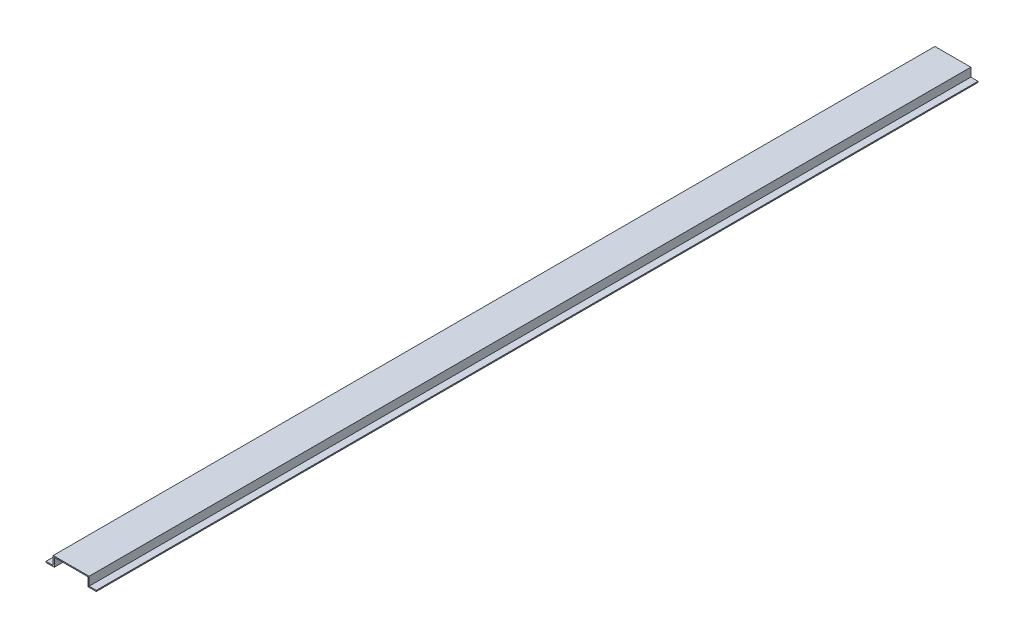
ISO-10303-21;
HEADER;
FILE_DESCRIPTION(('STEP AP214'),'2;1');
FILE_NAME('part.step','',(''),(''),'','','');
FILE_SCHEMA(('AUTOMOTIVE_DESIGN { 1 0 10303 214 1 1 1 1 }'));
ENDSEC;
DATA;
#1=APPLICATION_CONTEXT('core data for automotive mechanical design processes');
#2=APPLICATION_PROTOCOL_DEFINITION('international standard','automotive_design',2000,#1);
#3=PRODUCT_CONTEXT('',#1,'mechanical');
#4=PRODUCT('Part','Part','',(#3));
#5=PRODUCT_RELATED_PRODUCT_CATEGORY('part','',(#4));
#6=PRODUCT_DEFINITION_FORMATION('','',#4);
#7=PRODUCT_DEFINITION_CONTEXT('part definition',#1,'design');
#8=PRODUCT_DEFINITION('design','',#6,#7);
#9=PRODUCT_DEFINITION_SHAPE('','',#8);
#10=(LENGTH_UNIT() NAMED_UNIT(*) SI_UNIT(.MILLI.,.METRE.));
#11=(NAMED_UNIT(*) PLANE_ANGLE_UNIT() SI_UNIT($,.RADIAN.));
#12=(NAMED_UNIT(*) SI_UNIT($,.STERADIAN.) SOLID_ANGLE_UNIT());
#13=UNCERTAINTY_MEASURE_WITH_UNIT(LENGTH_MEASURE(1.E-05),#10,'distance_accuracy_value','');
#14=(GEOMETRIC_REPRESENTATION_CONTEXT(3) GLOBAL_UNCERTAINTY_ASSIGNED_CONTEXT((#13)) GLOBAL_UNIT_ASSIGNED_CONTEXT((#10,
#11,#12)) REPRESENTATION_CONTEXT('',''));
#15=CARTESIAN_POINT('',(0.,0.,0.));
#16=DIRECTION('',(0.,0.,1.));
#17=DIRECTION('',(1.,0.,0.));
#18=AXIS2_PLACEMENT_3D('',#15,#16,#17);
#19=CARTESIAN_POINT('',(190.,-497.,640.210098891919));
#20=DIRECTION('',(0.,1.,0.));
#21=DIRECTION('',(0.,0.,1.));
#22=AXIS2_PLACEMENT_3D('',#19,#20,#21);
#23=PLANE('',#22);
#24=DIRECTION('',(0.,0.,1.));
#25=VECTOR('',#24,1.);
#26=CARTESIAN_POINT('',(200.,-497.,640.210098891919));
#27=LINE('',#26,#25);
#28=CARTESIAN_POINT('',(200.,-497.,711.5));
#29=VERTEX_POINT('',#28);
#30=CARTESIAN_POINT('',(200.,-497.,1938.5));
#31=VERTEX_POINT('',#30);
#32=EDGE_CURVE('E120',#29,#31,#27,.T.);
#33=ORIENTED_EDGE('',*,*,#32,.F.);
#34=DIRECTION('',(-1.,0.,0.));
#35=VECTOR('',#34,1.);
#36=CARTESIAN_POINT('',(190.,-497.,711.5));
#37=LINE('',#36,#35);
#38=CARTESIAN_POINT('',(190.,-497.,711.5));
#39=VERTEX_POINT('',#38);
#40=EDGE_CURVE('E123',#29,#39,#37,.T.);
#41=ORIENTED_EDGE('',*,*,#40,.T.);
#42=DIRECTION('',(0.,0.,1.));
#43=VECTOR('',#42,1.);
#44=CARTESIAN_POINT('',(190.,-497.,640.210098891919));
#45=LINE('',#44,#43);
#46=CARTESIAN_POINT('',(190.,-497.,1938.5));
#47=VERTEX_POINT('',#46);
#48=EDGE_CURVE('E19',#39,#47,#45,.T.);
#49=ORIENTED_EDGE('',*,*,#48,.T.);
#50=DIRECTION('',(-1.,0.,0.));
#51=VECTOR('',#50,1.);
#52=CARTESIAN_POINT('',(190.,-497.,1938.5));
#53=LINE('',#52,#51);
#54=EDGE_CURVE('E161',#31,#47,#53,.T.);
#55=ORIENTED_EDGE('',*,*,#54,.F.);
#56=EDGE_LOOP('',(#33,#41,#49,#55));
#57=FACE_BOUND('',#56,.T.);
#58=ADVANCED_FACE('F15',(#57),#23,.T.);
#59=CARTESIAN_POINT('',(200.,-497.,640.210098891919));
#60=DIRECTION('',(-1.,0.,0.));
#61=DIRECTION('',(0.,0.,1.));
#62=AXIS2_PLACEMENT_3D('',#59,#60,#61);
#63=PLANE('',#62);
#64=DIRECTION('',(0.,0.,1.));
#65=VECTOR('',#64,1.);
#66=CARTESIAN_POINT('',(200.,-485.,640.210098891919));
#67=LINE('',#66,#65);
#68=CARTESIAN_POINT('',(200.,-485.,711.5));
#69=VERTEX_POINT('',#68);
#70=CARTESIAN_POINT('',(200.,-485.,1938.5));
#71=VERTEX_POINT('',#70);
#72=EDGE_CURVE('E117',#69,#71,#67,.T.);
#73=ORIENTED_EDGE('',*,*,#72,.F.);
#74=DIRECTION('',(0.,-1.,0.));
#75=VECTOR('',#74,1.);
#76=CARTESIAN_POINT('',(200.,-497.,711.5));
#77=LINE('',#76,#75);
#78=EDGE_CURVE('E121',#69,#29,#77,.T.);
#79=ORIENTED_EDGE('',*,*,#78,.T.);
#80=ORIENTED_EDGE('',*,*,#32,.T.);
#81=DIRECTION('',(0.,-1.,0.));
#82=VECTOR('',#81,1.);
#83=CARTESIAN_POINT('',(200.,-497.,1938.5));
#84=LINE('',#83,#82);
#85=EDGE_CURVE('E167',#71,#31,#84,.T.);
#86=ORIENTED_EDGE('',*,*,#85,.F.);
#87=EDGE_LOOP('',(#73,#79,#80,#86));
#88=FACE_BOUND('',#87,.T.);
#89=ADVANCED_FACE('F176',(#88),#63,.T.);
#90=CARTESIAN_POINT('',(250.,-485.,640.210098891919));
#91=DIRECTION('',(0.,1.,0.));
#92=DIRECTION('',(0.,0.,1.));
#93=AXIS2_PLACEMENT_3D('',#90,#91,#92);
#94=PLANE('',#93);
#95=DIRECTION('',(0.,0.,1.));
#96=VECTOR('',#95,1.);
#97=CARTESIAN_POINT('',(250.,-485.,640.210098891919));
#98=LINE('',#97,#96);
#99=CARTESIAN_POINT('',(250.,-485.,711.5));
#100=VERTEX_POINT('',#99);
#101=CARTESIAN_POINT('',(250.,-485.,1938.5));
#102=VERTEX_POINT('',#101);
#103=EDGE_CURVE('E114',#100,#102,#98,.T.);
#104=ORIENTED_EDGE('',*,*,#103,.F.);
#105=DIRECTION('',(-1.,0.,0.));
#106=VECTOR('',#105,1.);
#107=CARTESIAN_POINT('',(250.,-485.,711.5));
#108=LINE('',#107,#106);
#109=EDGE_CURVE('E118',#100,#69,#108,.T.);
#110=ORIENTED_EDGE('',*,*,#109,.T.);
#111=ORIENTED_EDGE('',*,*,#72,.T.);
#112=DIRECTION('',(-1.,0.,0.));
#113=VECTOR('',#112,1.);
#114=CARTESIAN_POINT('',(250.,-485.,1938.5));
#115=LINE('',#114,#113);
#116=EDGE_CURVE('E124',#102,#71,#115,.T.);
#117=ORIENTED_EDGE('',*,*,#116,.F.);
#118=EDGE_LOOP('',(#104,#110,#111,#117));
#119=FACE_BOUND('',#118,.T.);
#120=ADVANCED_FACE('F233',(#119),#94,.T.);
#121=CARTESIAN_POINT('',(250.,-497.,640.210098891919));
#122=DIRECTION('',(1.,0.,0.));
#123=DIRECTION('',(0.,0.,-1.));
#124=AXIS2_PLACEMENT_3D('',#121,#122,#123);
#125=PLANE('',#124);
#126=DIRECTION('',(0.,0.,1.));
#127=VECTOR('',#126,1.);
#128=CARTESIAN_POINT('',(250.,-497.,640.210098891919));
#129=LINE('',#128,#127);
#130=CARTESIAN_POINT('',(250.,-497.,711.5));
#131=VERTEX_POINT('',#130);
#132=CARTESIAN_POINT('',(250.,-497.,1938.5));
#133=VERTEX_POINT('',#132);
#134=EDGE_CURVE('E113',#131,#133,#129,.T.);
#135=ORIENTED_EDGE('',*,*,#134,.F.);
#136=DIRECTION('',(0.,1.,0.));
#137=VECTOR('',#136,1.);
#138=CARTESIAN_POINT('',(250.,-497.,711.5));
#139=LINE('',#138,#137);
#140=EDGE_CURVE('E115',#131,#100,#139,.T.);
#141=ORIENTED_EDGE('',*,*,#140,.T.);
#142=ORIENTED_EDGE('',*,*,#103,.T.);
#143=DIRECTION('',(0.,1.,0.));
#144=VECTOR('',#143,1.);
#145=CARTESIAN_POINT('',(250.,-497.,1938.5));
#146=LINE('',#145,#144);
#147=EDGE_CURVE('E208',#133,#102,#146,.T.);
#148=ORIENTED_EDGE('',*,*,#147,.F.);
#149=EDGE_LOOP('',(#135,#141,#142,#148));
#150=FACE_BOUND('',#149,.T.);
#151=ADVANCED_FACE('F209',(#150),#125,.T.);
#152=CARTESIAN_POINT('',(260.,-497.,640.210098891919));
#153=DIRECTION('',(0.,1.,0.));
#154=DIRECTION('',(0.,0.,1.));
#155=AXIS2_PLACEMENT_3D('',#152,#153,#154);
#156=PLANE('',#155);
#157=DIRECTION('',(0.,0.,1.));
#158=VECTOR('',#157,1.);
#159=CARTESIAN_POINT('',(260.,-497.,640.210098891919));
#160=LINE('',#159,#158);
#161=CARTESIAN_POINT('',(260.,-497.,711.5));
#162=VERTEX_POINT('',#161);
#163=CARTESIAN_POINT('',(260.,-497.,1938.5));
#164=VERTEX_POINT('',#163);
#165=EDGE_CURVE('E134',#162,#164,#160,.T.);
#166=ORIENTED_EDGE('',*,*,#165,.F.);
#167=DIRECTION('',(-1.,0.,0.));
#168=VECTOR('',#167,1.);
#169=CARTESIAN_POINT('',(260.,-497.,711.5));
#170=LINE('',#169,#168);
#171=EDGE_CURVE('E111',#162,#131,#170,.T.);
#172=ORIENTED_EDGE('',*,*,#171,.T.);
#173=ORIENTED_EDGE('',*,*,#134,.T.);
#174=DIRECTION('',(-1.,0.,0.));
#175=VECTOR('',#174,1.);
#176=CARTESIAN_POINT('',(260.,-497.,1938.5));
#177=LINE('',#176,#175);
#178=EDGE_CURVE('E166',#164,#133,#177,.T.);
#179=ORIENTED_EDGE('',*,*,#178,.F.);
#180=EDGE_LOOP('',(#166,#172,#173,#179));
#181=FACE_BOUND('',#180,.T.);
#182=ADVANCED_FACE('F201',(#181),#156,.T.);
#183=CARTESIAN_POINT('',(260.,-497.,640.210098891919));
#184=DIRECTION('',(-1.,0.,0.));
#185=DIRECTION('',(0.,0.,1.));
#186=AXIS2_PLACEMENT_3D('',#183,#184,#185);
#187=PLANE('',#186);
#188=DIRECTION('',(0.,-1.,0.));
#189=VECTOR('',#188,1.);
#190=CARTESIAN_POINT('',(260.,-497.,711.5));
#191=LINE('',#190,#189);
#192=CARTESIAN_POINT('',(260.,-498.5,711.5));
#193=VERTEX_POINT('',#192);
#194=EDGE_CURVE('E108',#162,#193,#191,.T.);
#195=ORIENTED_EDGE('',*,*,#194,.F.);
#196=ORIENTED_EDGE('',*,*,#165,.T.);
#197=DIRECTION('',(0.,-1.,0.));
#198=VECTOR('',#197,1.);
#199=CARTESIAN_POINT('',(260.,-497.,1938.5));
#200=LINE('',#199,#198);
#201=CARTESIAN_POINT('',(260.,-498.5,1938.5));
#202=VERTEX_POINT('',#201);
#203=EDGE_CURVE('E168',#164,#202,#200,.T.);
#204=ORIENTED_EDGE('',*,*,#203,.T.);
#205=DIRECTION('',(0.,0.,1.));
#206=VECTOR('',#205,1.);
#207=CARTESIAN_POINT('',(260.,-498.5,640.210098891919));
#208=LINE('',#207,#206);
#209=EDGE_CURVE('E137',#193,#202,#208,.T.);
#210=ORIENTED_EDGE('',*,*,#209,.F.);
#211=EDGE_LOOP('',(#195,#196,#204,#210));
#212=FACE_BOUND('',#211,.T.);
#213=ADVANCED_FACE('F232',(#212),#187,.F.);
#214=CARTESIAN_POINT('',(260.,-498.5,640.210098891919));
#215=DIRECTION('',(0.,1.,0.));
#216=DIRECTION('',(0.,0.,1.));
#217=AXIS2_PLACEMENT_3D('',#214,#215,#216);
#218=PLANE('',#217);
#219=DIRECTION('',(-1.,0.,0.));
#220=VECTOR('',#219,1.);
#221=CARTESIAN_POINT('',(260.,-498.5,711.5));
#222=LINE('',#221,#220);
#223=CARTESIAN_POINT('',(248.5,-498.5,711.5));
#224=VERTEX_POINT('',#223);
#225=EDGE_CURVE('E103',#193,#224,#222,.T.);
#226=ORIENTED_EDGE('',*,*,#225,.F.);
#227=ORIENTED_EDGE('',*,*,#209,.T.);
#228=DIRECTION('',(-1.,0.,0.));
#229=VECTOR('',#228,1.);
#230=CARTESIAN_POINT('',(260.,-498.5,1938.5));
#231=LINE('',#230,#229);
#232=CARTESIAN_POINT('',(248.5,-498.5,1938.5));
#233=VERTEX_POINT('',#232);
#234=EDGE_CURVE('E218',#202,#233,#231,.T.);
#235=ORIENTED_EDGE('',*,*,#234,.T.);
#236=DIRECTION('',(0.,0.,1.));
#237=VECTOR('',#236,1.);
#238=CARTESIAN_POINT('',(248.5,-498.5,640.210098891919));
#239=LINE('',#238,#237);
#240=EDGE_CURVE('E140',#224,#233,#239,.T.);
#241=ORIENTED_EDGE('',*,*,#240,.F.);
#242=EDGE_LOOP('',(#226,#227,#235,#241));
#243=FACE_BOUND('',#242,.T.);
#244=ADVANCED_FACE('F229',(#243),#218,.F.);
#245=CARTESIAN_POINT('',(248.5,-497.,640.210098891919));
#246=DIRECTION('',(1.,0.,0.));
#247=DIRECTION('',(0.,0.,-1.));
#248=AXIS2_PLACEMENT_3D('',#245,#246,#247);
#249=PLANE('',#248);
#250=DIRECTION('',(0.,1.,0.));
#251=VECTOR('',#250,1.);
#252=CARTESIAN_POINT('',(248.5,-497.,711.5));
#253=LINE('',#252,#251);
#254=CARTESIAN_POINT('',(248.5,-486.5,711.5));
#255=VERTEX_POINT('',#254);
#256=EDGE_CURVE('E101',#224,#255,#253,.T.);
#257=ORIENTED_EDGE('',*,*,#256,.F.);
#258=ORIENTED_EDGE('',*,*,#240,.T.);
#259=DIRECTION('',(0.,1.,0.));
#260=VECTOR('',#259,1.);
#261=CARTESIAN_POINT('',(248.5,-497.,1938.5));
#262=LINE('',#261,#260);
#263=CARTESIAN_POINT('',(248.5,-486.5,1938.5));
#264=VERTEX_POINT('',#263);
#265=EDGE_CURVE('E221',#233,#264,#262,.T.);
#266=ORIENTED_EDGE('',*,*,#265,.T.);
#267=DIRECTION('',(0.,0.,1.));
#268=VECTOR('',#267,1.);
#269=CARTESIAN_POINT('',(248.5,-486.5,640.210098891919));
#270=LINE('',#269,#268);
#271=EDGE_CURVE('E96',#255,#264,#270,.T.);
#272=ORIENTED_EDGE('',*,*,#271,.F.);
#273=EDGE_LOOP('',(#257,#258,#266,#272));
#274=FACE_BOUND('',#273,.T.);
#275=ADVANCED_FACE('F226',(#274),#249,.F.);
#276=CARTESIAN_POINT('',(250.,-486.5,640.210098891919));
#277=DIRECTION('',(0.,1.,0.));
#278=DIRECTION('',(0.,0.,1.));
#279=AXIS2_PLACEMENT_3D('',#276,#277,#278);
#280=PLANE('',#279);
#281=DIRECTION('',(-1.,0.,0.));
#282=VECTOR('',#281,1.);
#283=CARTESIAN_POINT('',(250.,-486.5,711.5));
#284=LINE('',#283,#282);
#285=CARTESIAN_POINT('',(201.5,-486.5,711.5));
#286=VERTEX_POINT('',#285);
#287=EDGE_CURVE('E87',#255,#286,#284,.T.);
#288=ORIENTED_EDGE('',*,*,#287,.F.);
#289=ORIENTED_EDGE('',*,*,#271,.T.);
#290=DIRECTION('',(-1.,0.,0.));
#291=VECTOR('',#290,1.);
#292=CARTESIAN_POINT('',(250.,-486.5,1938.5));
#293=LINE('',#292,#291);
#294=CARTESIAN_POINT('',(201.5,-486.5,1938.5));
#295=VERTEX_POINT('',#294);
#296=EDGE_CURVE('E94',#264,#295,#293,.T.);
#297=ORIENTED_EDGE('',*,*,#296,.T.);
#298=DIRECTION('',(0.,0.,1.));
#299=VECTOR('',#298,1.);
#300=CARTESIAN_POINT('',(201.5,-486.5,640.210098891919));
#301=LINE('',#300,#299);
#302=EDGE_CURVE('E80',#286,#295,#301,.T.);
#303=ORIENTED_EDGE('',*,*,#302,.F.);
#304=EDGE_LOOP('',(#288,#289,#297,#303));
#305=FACE_BOUND('',#304,.T.);
#306=ADVANCED_FACE('F90',(#305),#280,.F.);
#307=CARTESIAN_POINT('',(201.5,-497.,640.210098891919));
#308=DIRECTION('',(-1.,0.,0.));
#309=DIRECTION('',(0.,0.,1.));
#310=AXIS2_PLACEMENT_3D('',#307,#308,#309);
#311=PLANE('',#310);
#312=DIRECTION('',(0.,-1.,0.));
#313=VECTOR('',#312,1.);
#314=CARTESIAN_POINT('',(201.5,-497.,711.5));
#315=LINE('',#314,#313);
#316=CARTESIAN_POINT('',(201.5,-498.5,711.5));
#317=VERTEX_POINT('',#316);
#318=EDGE_CURVE('E75',#286,#317,#315,.T.);
#319=ORIENTED_EDGE('',*,*,#318,.F.);
#320=ORIENTED_EDGE('',*,*,#302,.T.);
#321=DIRECTION('',(0.,-1.,0.));
#322=VECTOR('',#321,1.);
#323=CARTESIAN_POINT('',(201.5,-497.,1938.5));
#324=LINE('',#323,#322);
#325=CARTESIAN_POINT('',(201.5,-498.5,1938.5));
#326=VERTEX_POINT('',#325);
#327=EDGE_CURVE('E156',#295,#326,#324,.T.);
#328=ORIENTED_EDGE('',*,*,#327,.T.);
#329=DIRECTION('',(0.,0.,1.));
#330=VECTOR('',#329,1.);
#331=CARTESIAN_POINT('',(201.5,-498.5,640.210098891919));
#332=LINE('',#331,#330);
#333=EDGE_CURVE('E83',#317,#326,#332,.T.);
#334=ORIENTED_EDGE('',*,*,#333,.F.);
#335=EDGE_LOOP('',(#319,#320,#328,#334));
#336=FACE_BOUND('',#335,.T.);
#337=ADVANCED_FACE('F77',(#336),#311,.F.);
#338=CARTESIAN_POINT('',(190.,-498.5,640.210098891919));
#339=DIRECTION('',(0.,1.,0.));
#340=DIRECTION('',(0.,0.,1.));
#341=AXIS2_PLACEMENT_3D('',#338,#339,#340);
#342=PLANE('',#341);
#343=DIRECTION('',(-1.,0.,0.));
#344=VECTOR('',#343,1.);
#345=CARTESIAN_POINT('',(190.,-498.5,711.5));
#346=LINE('',#345,#344);
#347=CARTESIAN_POINT('',(190.,-498.5,711.5));
#348=VERTEX_POINT('',#347);
#349=EDGE_CURVE('E24',#317,#348,#346,.T.);
#350=ORIENTED_EDGE('',*,*,#349,.F.);
#351=ORIENTED_EDGE('',*,*,#333,.T.);
#352=DIRECTION('',(-1.,0.,0.));
#353=VECTOR('',#352,1.);
#354=CARTESIAN_POINT('',(190.,-498.5,1938.5));
#355=LINE('',#354,#353);
#356=CARTESIAN_POINT('',(190.,-498.5,1938.5));
#357=VERTEX_POINT('',#356);
#358=EDGE_CURVE('E153',#326,#357,#355,.T.);
#359=ORIENTED_EDGE('',*,*,#358,.T.);
#360=DIRECTION('',(0.,0.,1.));
#361=VECTOR('',#360,1.);
#362=CARTESIAN_POINT('',(190.,-498.5,640.210098891919));
#363=LINE('',#362,#361);
#364=EDGE_CURVE('E40',#348,#357,#363,.T.);
#365=ORIENTED_EDGE('',*,*,#364,.F.);
#366=EDGE_LOOP('',(#350,#351,#359,#365));
#367=FACE_BOUND('',#366,.T.);
#368=ADVANCED_FACE('F154',(#367),#342,.F.);
#369=CARTESIAN_POINT('',(190.,-498.5,640.210098891919));
#370=DIRECTION('',(1.,0.,0.));
#371=DIRECTION('',(0.,0.,-1.));
#372=AXIS2_PLACEMENT_3D('',#369,#370,#371);
#373=PLANE('',#372);
#374=DIRECTION('',(0.,1.,0.));
#375=VECTOR('',#374,1.);
#376=CARTESIAN_POINT('',(190.,-498.5,711.5));
#377=LINE('',#376,#375);
#378=EDGE_CURVE('E10',#348,#39,#377,.T.);
#379=ORIENTED_EDGE('',*,*,#378,.F.);
#380=ORIENTED_EDGE('',*,*,#364,.T.);
#381=DIRECTION('',(0.,1.,0.));
#382=VECTOR('',#381,1.);
#383=CARTESIAN_POINT('',(190.,-498.5,1938.5));
#384=LINE('',#383,#382);
#385=EDGE_CURVE('E148',#357,#47,#384,.T.);
#386=ORIENTED_EDGE('',*,*,#385,.T.);
#387=ORIENTED_EDGE('',*,*,#48,.F.);
#388=EDGE_LOOP('',(#379,#380,#386,#387));
#389=FACE_BOUND('',#388,.T.);
#390=ADVANCED_FACE('F145',(#389),#373,.F.);
#391=CARTESIAN_POINT('',(338.5,-486.5,711.5));
#392=DIRECTION('',(0.,0.,-1.));
#393=DIRECTION('',(-1.,0.,0.));
#394=AXIS2_PLACEMENT_3D('',#391,#392,#393);
#395=PLANE('',#394);
#396=ORIENTED_EDGE('',*,*,#40,.F.);
#397=ORIENTED_EDGE('',*,*,#78,.F.);
#398=ORIENTED_EDGE('',*,*,#109,.F.);
#399=ORIENTED_EDGE('',*,*,#140,.F.);
#400=ORIENTED_EDGE('',*,*,#171,.F.);
#401=ORIENTED_EDGE('',*,*,#194,.T.);
#402=ORIENTED_EDGE('',*,*,#225,.T.);
#403=ORIENTED_EDGE('',*,*,#256,.T.);
#404=ORIENTED_EDGE('',*,*,#287,.T.);
#405=ORIENTED_EDGE('',*,*,#318,.T.);
#406=ORIENTED_EDGE('',*,*,#349,.T.);
#407=ORIENTED_EDGE('',*,*,#378,.T.);
#408=EDGE_LOOP('',(#396,#397,#398,#399,#400,#401,#402,#403,#404,#405,#406,#407));
#409=FACE_BOUND('',#408,.T.);
#410=ADVANCED_FACE('F17',(#409),#395,.T.);
#411=CARTESIAN_POINT('',(-338.5,-486.5,1938.5));
#412=DIRECTION('',(0.,0.,1.));
#413=DIRECTION('',(1.,0.,0.));
#414=AXIS2_PLACEMENT_3D('',#411,#412,#413);
#415=PLANE('',#414);
#416=ORIENTED_EDGE('',*,*,#85,.T.);
#417=ORIENTED_EDGE('',*,*,#54,.T.);
#418=ORIENTED_EDGE('',*,*,#385,.F.);
#419=ORIENTED_EDGE('',*,*,#358,.F.);
#420=ORIENTED_EDGE('',*,*,#327,.F.);
#421=ORIENTED_EDGE('',*,*,#296,.F.);
#422=ORIENTED_EDGE('',*,*,#265,.F.);
#423=ORIENTED_EDGE('',*,*,#234,.F.);
#424=ORIENTED_EDGE('',*,*,#203,.F.);
#425=ORIENTED_EDGE('',*,*,#178,.T.);
#426=ORIENTED_EDGE('',*,*,#147,.T.);
#427=ORIENTED_EDGE('',*,*,#116,.T.);
#428=EDGE_LOOP('',(#416,#417,#418,#419,#420,#421,#422,#423,#424,#425,#426,#427));
#429=FACE_BOUND('',#428,.T.);
#430=ADVANCED_FACE('F159',(#429),#415,.T.);
#431=CLOSED_SHELL('',(#58,#89,#120,#151,#182,#213,#244,#275,#306,#337,#368,#390,#410,#430));
#432=MANIFOLD_SOLID_BREP('B1',#431);
#433=ADVANCED_BREP_SHAPE_REPRESENTATION('',(#18,#432),#14);
#434=SHAPE_DEFINITION_REPRESENTATION(#9,#433);
ENDSEC;
END-ISO-10303-21;
